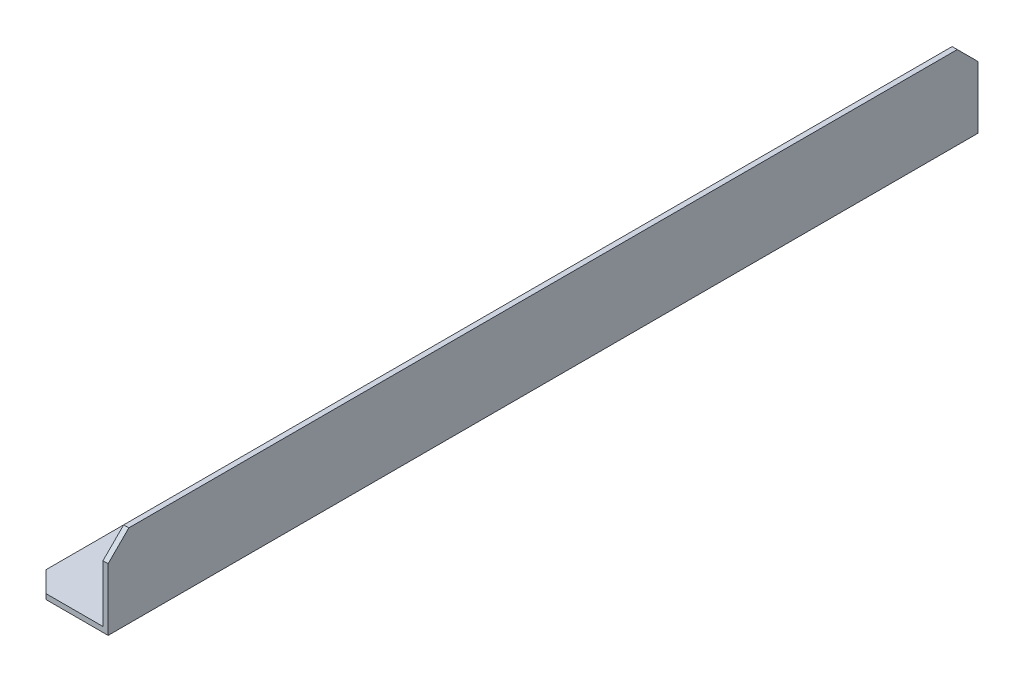
ISO-10303-21;
HEADER;
FILE_DESCRIPTION(('STEP AP214'),'2;1');
FILE_NAME('part.step','',(''),(''),'','','');
FILE_SCHEMA(('AUTOMOTIVE_DESIGN { 1 0 10303 214 1 1 1 1 }'));
ENDSEC;
DATA;
#1=APPLICATION_CONTEXT('core data for automotive mechanical design processes');
#2=APPLICATION_PROTOCOL_DEFINITION('international standard','automotive_design',2000,#1);
#3=PRODUCT_CONTEXT('',#1,'mechanical');
#4=PRODUCT('Part','Part','',(#3));
#5=PRODUCT_RELATED_PRODUCT_CATEGORY('part','',(#4));
#6=PRODUCT_DEFINITION_FORMATION('','',#4);
#7=PRODUCT_DEFINITION_CONTEXT('part definition',#1,'design');
#8=PRODUCT_DEFINITION('design','',#6,#7);
#9=PRODUCT_DEFINITION_SHAPE('','',#8);
#10=(LENGTH_UNIT() NAMED_UNIT(*) SI_UNIT(.MILLI.,.METRE.));
#11=(NAMED_UNIT(*) PLANE_ANGLE_UNIT() SI_UNIT($,.RADIAN.));
#12=(NAMED_UNIT(*) SI_UNIT($,.STERADIAN.) SOLID_ANGLE_UNIT());
#13=UNCERTAINTY_MEASURE_WITH_UNIT(LENGTH_MEASURE(1.E-05),#10,'distance_accuracy_value','');
#14=(GEOMETRIC_REPRESENTATION_CONTEXT(3) GLOBAL_UNCERTAINTY_ASSIGNED_CONTEXT((#13)) GLOBAL_UNIT_ASSIGNED_CONTEXT((#10,
#11,#12)) REPRESENTATION_CONTEXT('',''));
#15=CARTESIAN_POINT('',(0.,0.,0.));
#16=DIRECTION('',(0.,0.,1.));
#17=DIRECTION('',(1.,0.,0.));
#18=AXIS2_PLACEMENT_3D('',#15,#16,#17);
#19=CARTESIAN_POINT('',(0.,0.,-533.4));
#20=DIRECTION('',(0.,-1.,0.));
#21=DIRECTION('',(0.,0.,-1.));
#22=AXIS2_PLACEMENT_3D('',#19,#20,#21);
#23=PLANE('',#22);
#24=CARTESIAN_POINT('',(-26.9875,0.,-38.1000000000001));
#25=DIRECTION('',(0.,1.,0.));
#26=DIRECTION('',(0.,0.,1.));
#27=AXIS2_PLACEMENT_3D('',#24,#25,#26);
#28=CIRCLE('',#27,2.45745);
#29=CARTESIAN_POINT('',(-26.9875,0.,-35.6425500000001));
#30=VERTEX_POINT('',#29);
#31=EDGE_CURVE('E446',#30,#30,#28,.T.);
#32=ORIENTED_EDGE('',*,*,#31,.T.);
#33=EDGE_LOOP('',(#32));
#34=FACE_BOUND('',#33,.T.);
#35=CARTESIAN_POINT('',(-26.9875,0.,-152.4));
#36=DIRECTION('',(0.,1.,0.));
#37=DIRECTION('',(0.,0.,1.));
#38=AXIS2_PLACEMENT_3D('',#35,#36,#37);
#39=CIRCLE('',#38,2.45745);
#40=CARTESIAN_POINT('',(-26.9875,0.,-149.94255));
#41=VERTEX_POINT('',#40);
#42=EDGE_CURVE('E456',#41,#41,#39,.T.);
#43=ORIENTED_EDGE('',*,*,#42,.T.);
#44=EDGE_LOOP('',(#43));
#45=FACE_BOUND('',#44,.T.);
#46=CARTESIAN_POINT('',(-26.9875,0.,-266.7));
#47=DIRECTION('',(0.,1.,0.));
#48=DIRECTION('',(0.,0.,1.));
#49=AXIS2_PLACEMENT_3D('',#46,#47,#48);
#50=CIRCLE('',#49,2.45745);
#51=CARTESIAN_POINT('',(-26.9875,0.,-264.24255));
#52=VERTEX_POINT('',#51);
#53=EDGE_CURVE('E465',#52,#52,#50,.T.);
#54=ORIENTED_EDGE('',*,*,#53,.T.);
#55=EDGE_LOOP('',(#54));
#56=FACE_BOUND('',#55,.T.);
#57=CARTESIAN_POINT('',(-26.9875,0.,-381.));
#58=DIRECTION('',(0.,1.,0.));
#59=DIRECTION('',(0.,0.,1.));
#60=AXIS2_PLACEMENT_3D('',#57,#58,#59);
#61=CIRCLE('',#60,2.45745);
#62=CARTESIAN_POINT('',(-26.9875,0.,-378.54255));
#63=VERTEX_POINT('',#62);
#64=EDGE_CURVE('E474',#63,#63,#61,.T.);
#65=ORIENTED_EDGE('',*,*,#64,.T.);
#66=EDGE_LOOP('',(#65));
#67=FACE_BOUND('',#66,.T.);
#68=CARTESIAN_POINT('',(-26.9875,0.,-495.3));
#69=DIRECTION('',(0.,1.,0.));
#70=DIRECTION('',(0.,0.,1.));
#71=AXIS2_PLACEMENT_3D('',#68,#69,#70);
#72=CIRCLE('',#71,2.45745);
#73=CARTESIAN_POINT('',(-26.9875,0.,-492.84255));
#74=VERTEX_POINT('',#73);
#75=EDGE_CURVE('E155',#74,#74,#72,.T.);
#76=ORIENTED_EDGE('',*,*,#75,.T.);
#77=EDGE_LOOP('',(#76));
#78=FACE_BOUND('',#77,.T.);
#79=DIRECTION('',(0.,0.,1.));
#80=VECTOR('',#79,1.);
#81=CARTESIAN_POINT('',(-50.8,0.,-533.4));
#82=LINE('',#81,#80);
#83=CARTESIAN_POINT('',(-50.8,0.,-520.7));
#84=VERTEX_POINT('',#83);
#85=CARTESIAN_POINT('',(-50.8,0.,-12.7));
#86=VERTEX_POINT('',#85);
#87=EDGE_CURVE('E161',#84,#86,#82,.T.);
#88=ORIENTED_EDGE('',*,*,#87,.F.);
#89=DIRECTION('',(-0.707106781186546,0.,0.707106781186549));
#90=VECTOR('',#89,1.);
#91=CARTESIAN_POINT('',(-19.05,0.,-552.45));
#92=LINE('',#91,#90);
#93=CARTESIAN_POINT('',(-38.0999999999999,0.,-533.4));
#94=VERTEX_POINT('',#93);
#95=EDGE_CURVE('E128',#84,#94,#92,.F.);
#96=ORIENTED_EDGE('',*,*,#95,.T.);
#97=DIRECTION('',(1.,0.,0.));
#98=VECTOR('',#97,1.);
#99=CARTESIAN_POINT('',(0.,0.,-533.4));
#100=LINE('',#99,#98);
#101=CARTESIAN_POINT('',(0.,0.,-533.4));
#102=VERTEX_POINT('',#101);
#103=EDGE_CURVE('E123',#94,#102,#100,.T.);
#104=ORIENTED_EDGE('',*,*,#103,.T.);
#105=DIRECTION('',(0.,0.,1.));
#106=VECTOR('',#105,1.);
#107=CARTESIAN_POINT('',(0.,0.,-533.4));
#108=LINE('',#107,#106);
#109=CARTESIAN_POINT('',(0.,0.,0.));
#110=VERTEX_POINT('',#109);
#111=EDGE_CURVE('E127',#102,#110,#108,.T.);
#112=ORIENTED_EDGE('',*,*,#111,.T.);
#113=DIRECTION('',(1.,0.,0.));
#114=VECTOR('',#113,1.);
#115=CARTESIAN_POINT('',(0.,0.,0.));
#116=LINE('',#115,#114);
#117=CARTESIAN_POINT('',(-38.1,0.,0.));
#118=VERTEX_POINT('',#117);
#119=EDGE_CURVE('E153',#118,#110,#116,.T.);
#120=ORIENTED_EDGE('',*,*,#119,.F.);
#121=DIRECTION('',(-0.707106781186548,0.,-0.707106781186548));
#122=VECTOR('',#121,1.);
#123=CARTESIAN_POINT('',(-285.75,0.,-247.65));
#124=LINE('',#123,#122);
#125=EDGE_CURVE('E179',#118,#86,#124,.T.);
#126=ORIENTED_EDGE('',*,*,#125,.T.);
#127=EDGE_LOOP('',(#88,#96,#104,#112,#120,#126));
#128=FACE_BOUND('',#127,.T.);
#129=ADVANCED_FACE('F43',(#34,#45,#56,#67,#78,#128),#23,.T.);
#130=CARTESIAN_POINT('',(-50.8,0.,-533.4));
#131=DIRECTION('',(-1.,0.,0.));
#132=DIRECTION('',(0.,0.,1.));
#133=AXIS2_PLACEMENT_3D('',#130,#131,#132);
#134=PLANE('',#133);
#135=DIRECTION('',(0.,0.,1.));
#136=VECTOR('',#135,1.);
#137=CARTESIAN_POINT('',(-50.8,3.175,-533.4));
#138=LINE('',#137,#136);
#139=CARTESIAN_POINT('',(-50.8,3.175,-520.7));
#140=VERTEX_POINT('',#139);
#141=CARTESIAN_POINT('',(-50.8,3.175,-12.7));
#142=VERTEX_POINT('',#141);
#143=EDGE_CURVE('E165',#140,#142,#138,.T.);
#144=ORIENTED_EDGE('',*,*,#143,.F.);
#145=DIRECTION('',(0.,-1.,0.));
#146=VECTOR('',#145,1.);
#147=CARTESIAN_POINT('',(-50.8,0.,-520.7));
#148=LINE('',#147,#146);
#149=EDGE_CURVE('E176',#140,#84,#148,.T.);
#150=ORIENTED_EDGE('',*,*,#149,.T.);
#151=ORIENTED_EDGE('',*,*,#87,.T.);
#152=DIRECTION('',(0.,1.,0.));
#153=VECTOR('',#152,1.);
#154=CARTESIAN_POINT('',(-50.8,3.175,-12.7));
#155=LINE('',#154,#153);
#156=EDGE_CURVE('E164',#86,#142,#155,.T.);
#157=ORIENTED_EDGE('',*,*,#156,.T.);
#158=EDGE_LOOP('',(#144,#150,#151,#157));
#159=FACE_BOUND('',#158,.T.);
#160=ADVANCED_FACE('F209',(#159),#134,.T.);
#161=CARTESIAN_POINT('',(-3.175,3.175,-533.4));
#162=DIRECTION('',(0.,1.,0.));
#163=DIRECTION('',(0.,0.,1.));
#164=AXIS2_PLACEMENT_3D('',#161,#162,#163);
#165=PLANE('',#164);
#166=CARTESIAN_POINT('',(-26.9875,3.175,-38.1000000000001));
#167=DIRECTION('',(0.,1.,0.));
#168=DIRECTION('',(0.,0.,1.));
#169=AXIS2_PLACEMENT_3D('',#166,#167,#168);
#170=CIRCLE('',#169,4.2164);
#171=CARTESIAN_POINT('',(-26.9875,3.175,-33.8836000000001));
#172=VERTEX_POINT('',#171);
#173=EDGE_CURVE('E444',#172,#172,#170,.T.);
#174=ORIENTED_EDGE('',*,*,#173,.F.);
#175=EDGE_LOOP('',(#174));
#176=FACE_BOUND('',#175,.T.);
#177=CARTESIAN_POINT('',(-26.9875,3.175,-152.4));
#178=DIRECTION('',(0.,1.,0.));
#179=DIRECTION('',(0.,0.,1.));
#180=AXIS2_PLACEMENT_3D('',#177,#178,#179);
#181=CIRCLE('',#180,4.2164);
#182=CARTESIAN_POINT('',(-26.9875,3.175,-148.1836));
#183=VERTEX_POINT('',#182);
#184=EDGE_CURVE('E450',#183,#183,#181,.T.);
#185=ORIENTED_EDGE('',*,*,#184,.F.);
#186=EDGE_LOOP('',(#185));
#187=FACE_BOUND('',#186,.T.);
#188=CARTESIAN_POINT('',(-26.9875,3.175,-266.7));
#189=DIRECTION('',(0.,1.,0.));
#190=DIRECTION('',(0.,0.,1.));
#191=AXIS2_PLACEMENT_3D('',#188,#189,#190);
#192=CIRCLE('',#191,4.2164);
#193=CARTESIAN_POINT('',(-26.9875,3.175,-262.4836));
#194=VERTEX_POINT('',#193);
#195=EDGE_CURVE('E459',#194,#194,#192,.T.);
#196=ORIENTED_EDGE('',*,*,#195,.F.);
#197=EDGE_LOOP('',(#196));
#198=FACE_BOUND('',#197,.T.);
#199=CARTESIAN_POINT('',(-26.9875,3.175,-381.));
#200=DIRECTION('',(0.,1.,0.));
#201=DIRECTION('',(0.,0.,1.));
#202=AXIS2_PLACEMENT_3D('',#199,#200,#201);
#203=CIRCLE('',#202,4.2164);
#204=CARTESIAN_POINT('',(-26.9875,3.175,-376.7836));
#205=VERTEX_POINT('',#204);
#206=EDGE_CURVE('E468',#205,#205,#203,.T.);
#207=ORIENTED_EDGE('',*,*,#206,.F.);
#208=EDGE_LOOP('',(#207));
#209=FACE_BOUND('',#208,.T.);
#210=CARTESIAN_POINT('',(-26.9875,3.175,-495.3));
#211=DIRECTION('',(0.,1.,0.));
#212=DIRECTION('',(0.,0.,1.));
#213=AXIS2_PLACEMENT_3D('',#210,#211,#212);
#214=CIRCLE('',#213,4.2164);
#215=CARTESIAN_POINT('',(-26.9875,3.175,-491.0836));
#216=VERTEX_POINT('',#215);
#217=EDGE_CURVE('E477',#216,#216,#214,.T.);
#218=ORIENTED_EDGE('',*,*,#217,.F.);
#219=EDGE_LOOP('',(#218));
#220=FACE_BOUND('',#219,.T.);
#221=DIRECTION('',(-1.,0.,0.));
#222=VECTOR('',#221,1.);
#223=CARTESIAN_POINT('',(-3.175,3.175,-533.4));
#224=LINE('',#223,#222);
#225=CARTESIAN_POINT('',(-3.175,3.175,-533.4));
#226=VERTEX_POINT('',#225);
#227=CARTESIAN_POINT('',(-38.0999999999999,3.175,-533.4));
#228=VERTEX_POINT('',#227);
#229=EDGE_CURVE('E140',#226,#228,#224,.T.);
#230=ORIENTED_EDGE('',*,*,#229,.T.);
#231=DIRECTION('',(0.707106781186546,0.,-0.707106781186549));
#232=VECTOR('',#231,1.);
#233=CARTESIAN_POINT('',(-20.6375,3.175,-550.8625));
#234=LINE('',#233,#232);
#235=EDGE_CURVE('E187',#228,#140,#234,.F.);
#236=ORIENTED_EDGE('',*,*,#235,.T.);
#237=ORIENTED_EDGE('',*,*,#143,.T.);
#238=DIRECTION('',(0.707106781186548,0.,0.707106781186548));
#239=VECTOR('',#238,1.);
#240=CARTESIAN_POINT('',(-287.3375,3.175,-249.2375));
#241=LINE('',#240,#239);
#242=CARTESIAN_POINT('',(-38.1,3.175,0.));
#243=VERTEX_POINT('',#242);
#244=EDGE_CURVE('E185',#142,#243,#241,.T.);
#245=ORIENTED_EDGE('',*,*,#244,.T.);
#246=DIRECTION('',(-1.,0.,0.));
#247=VECTOR('',#246,1.);
#248=CARTESIAN_POINT('',(-3.175,3.175,0.));
#249=LINE('',#248,#247);
#250=CARTESIAN_POINT('',(-3.175,3.175,0.));
#251=VERTEX_POINT('',#250);
#252=EDGE_CURVE('E133',#251,#243,#249,.T.);
#253=ORIENTED_EDGE('',*,*,#252,.F.);
#254=DIRECTION('',(0.,0.,1.));
#255=VECTOR('',#254,1.);
#256=CARTESIAN_POINT('',(-3.175,3.175,-533.4));
#257=LINE('',#256,#255);
#258=EDGE_CURVE('E168',#226,#251,#257,.T.);
#259=ORIENTED_EDGE('',*,*,#258,.F.);
#260=EDGE_LOOP('',(#230,#236,#237,#245,#253,#259));
#261=FACE_BOUND('',#260,.T.);
#262=ADVANCED_FACE('F212',(#176,#187,#198,#209,#220,#261),#165,.T.);
#263=CARTESIAN_POINT('',(-3.175,3.175,-533.4));
#264=DIRECTION('',(-1.,0.,0.));
#265=DIRECTION('',(0.,0.,1.));
#266=AXIS2_PLACEMENT_3D('',#263,#264,#265);
#267=PLANE('',#266);
#268=DIRECTION('',(0.,0.,1.));
#269=VECTOR('',#268,1.);
#270=CARTESIAN_POINT('',(-3.175,50.8,-533.4));
#271=LINE('',#270,#269);
#272=CARTESIAN_POINT('',(-3.175,50.8,-520.7));
#273=VERTEX_POINT('',#272);
#274=CARTESIAN_POINT('',(-3.175,50.8,-12.7));
#275=VERTEX_POINT('',#274);
#276=EDGE_CURVE('E171',#273,#275,#271,.T.);
#277=ORIENTED_EDGE('',*,*,#276,.F.);
#278=DIRECTION('',(0.,0.707106781186546,0.707106781186549));
#279=VECTOR('',#278,1.);
#280=CARTESIAN_POINT('',(-3.175,20.6375,-550.8625));
#281=LINE('',#280,#279);
#282=CARTESIAN_POINT('',(-3.175,38.0999999999999,-533.4));
#283=VERTEX_POINT('',#282);
#284=EDGE_CURVE('E195',#273,#283,#281,.F.);
#285=ORIENTED_EDGE('',*,*,#284,.T.);
#286=DIRECTION('',(0.,-1.,0.));
#287=VECTOR('',#286,1.);
#288=CARTESIAN_POINT('',(-3.175,3.175,-533.4));
#289=LINE('',#288,#287);
#290=EDGE_CURVE('E146',#283,#226,#289,.T.);
#291=ORIENTED_EDGE('',*,*,#290,.T.);
#292=ORIENTED_EDGE('',*,*,#258,.T.);
#293=DIRECTION('',(0.,-1.,0.));
#294=VECTOR('',#293,1.);
#295=CARTESIAN_POINT('',(-3.175,3.175,0.));
#296=LINE('',#295,#294);
#297=CARTESIAN_POINT('',(-3.175,38.1,0.));
#298=VERTEX_POINT('',#297);
#299=EDGE_CURVE('E157',#298,#251,#296,.T.);
#300=ORIENTED_EDGE('',*,*,#299,.F.);
#301=DIRECTION('',(0.,0.707106781186548,-0.707106781186548));
#302=VECTOR('',#301,1.);
#303=CARTESIAN_POINT('',(-3.175,287.3375,-249.2375));
#304=LINE('',#303,#302);
#305=EDGE_CURVE('E67',#298,#275,#304,.T.);
#306=ORIENTED_EDGE('',*,*,#305,.T.);
#307=EDGE_LOOP('',(#277,#285,#291,#292,#300,#306));
#308=FACE_BOUND('',#307,.T.);
#309=ADVANCED_FACE('F221',(#308),#267,.T.);
#310=CARTESIAN_POINT('',(0.,50.8,-533.4));
#311=DIRECTION('',(0.,1.,0.));
#312=DIRECTION('',(0.,0.,1.));
#313=AXIS2_PLACEMENT_3D('',#310,#311,#312);
#314=PLANE('',#313);
#315=DIRECTION('',(0.,0.,1.));
#316=VECTOR('',#315,1.);
#317=CARTESIAN_POINT('',(0.,50.8,-533.4));
#318=LINE('',#317,#316);
#319=CARTESIAN_POINT('',(0.,50.8,-520.7));
#320=VERTEX_POINT('',#319);
#321=CARTESIAN_POINT('',(0.,50.8,-12.7));
#322=VERTEX_POINT('',#321);
#323=EDGE_CURVE('E139',#320,#322,#318,.T.);
#324=ORIENTED_EDGE('',*,*,#323,.F.);
#325=DIRECTION('',(-1.,0.,0.));
#326=VECTOR('',#325,1.);
#327=CARTESIAN_POINT('',(0.,50.8,-520.7));
#328=LINE('',#327,#326);
#329=EDGE_CURVE('E191',#320,#273,#328,.T.);
#330=ORIENTED_EDGE('',*,*,#329,.T.);
#331=ORIENTED_EDGE('',*,*,#276,.T.);
#332=DIRECTION('',(1.,0.,0.));
#333=VECTOR('',#332,1.);
#334=CARTESIAN_POINT('',(0.,50.8,-12.7));
#335=LINE('',#334,#333);
#336=EDGE_CURVE('E189',#275,#322,#335,.T.);
#337=ORIENTED_EDGE('',*,*,#336,.T.);
#338=EDGE_LOOP('',(#324,#330,#331,#337));
#339=FACE_BOUND('',#338,.T.);
#340=ADVANCED_FACE('F227',(#339),#314,.T.);
#341=CARTESIAN_POINT('',(0.,0.,-533.4));
#342=DIRECTION('',(1.,0.,0.));
#343=DIRECTION('',(0.,1.,0.));
#344=AXIS2_PLACEMENT_3D('',#341,#342,#343);
#345=PLANE('',#344);
#346=DIRECTION('',(0.,1.,0.));
#347=VECTOR('',#346,1.);
#348=CARTESIAN_POINT('',(0.,0.,-533.4));
#349=LINE('',#348,#347);
#350=CARTESIAN_POINT('',(0.,38.0999999999999,-533.4));
#351=VERTEX_POINT('',#350);
#352=EDGE_CURVE('E132',#102,#351,#349,.T.);
#353=ORIENTED_EDGE('',*,*,#352,.T.);
#354=DIRECTION('',(0.,-0.707106781186546,-0.707106781186549));
#355=VECTOR('',#354,1.);
#356=CARTESIAN_POINT('',(0.,19.05,-552.45));
#357=LINE('',#356,#355);
#358=EDGE_CURVE('E198',#351,#320,#357,.F.);
#359=ORIENTED_EDGE('',*,*,#358,.T.);
#360=ORIENTED_EDGE('',*,*,#323,.T.);
#361=DIRECTION('',(0.,-0.707106781186548,0.707106781186548));
#362=VECTOR('',#361,1.);
#363=CARTESIAN_POINT('',(0.,285.75,-247.65));
#364=LINE('',#363,#362);
#365=CARTESIAN_POINT('',(0.,38.1,0.));
#366=VERTEX_POINT('',#365);
#367=EDGE_CURVE('E59',#322,#366,#364,.T.);
#368=ORIENTED_EDGE('',*,*,#367,.T.);
#369=DIRECTION('',(0.,1.,0.));
#370=VECTOR('',#369,1.);
#371=CARTESIAN_POINT('',(0.,0.,0.));
#372=LINE('',#371,#370);
#373=EDGE_CURVE('E138',#110,#366,#372,.T.);
#374=ORIENTED_EDGE('',*,*,#373,.F.);
#375=ORIENTED_EDGE('',*,*,#111,.F.);
#376=EDGE_LOOP('',(#353,#359,#360,#368,#374,#375));
#377=FACE_BOUND('',#376,.T.);
#378=ADVANCED_FACE('F136',(#377),#345,.T.);
#379=CARTESIAN_POINT('',(0.,0.,-533.4));
#380=DIRECTION('',(0.,0.,-1.));
#381=DIRECTION('',(-1.,0.,0.));
#382=AXIS2_PLACEMENT_3D('',#379,#380,#381);
#383=PLANE('',#382);
#384=ORIENTED_EDGE('',*,*,#103,.F.);
#385=DIRECTION('',(0.,1.,0.));
#386=VECTOR('',#385,1.);
#387=CARTESIAN_POINT('',(-38.0999999999999,0.,-533.4));
#388=LINE('',#387,#386);
#389=EDGE_CURVE('E183',#94,#228,#388,.T.);
#390=ORIENTED_EDGE('',*,*,#389,.T.);
#391=ORIENTED_EDGE('',*,*,#229,.F.);
#392=ORIENTED_EDGE('',*,*,#290,.F.);
#393=DIRECTION('',(1.,0.,0.));
#394=VECTOR('',#393,1.);
#395=CARTESIAN_POINT('',(0.,38.0999999999999,-533.4));
#396=LINE('',#395,#394);
#397=EDGE_CURVE('E145',#283,#351,#396,.T.);
#398=ORIENTED_EDGE('',*,*,#397,.T.);
#399=ORIENTED_EDGE('',*,*,#352,.F.);
#400=EDGE_LOOP('',(#384,#390,#391,#392,#398,#399));
#401=FACE_BOUND('',#400,.T.);
#402=ADVANCED_FACE('F142',(#401),#383,.T.);
#403=CARTESIAN_POINT('',(0.,0.,0.));
#404=DIRECTION('',(0.,0.,-1.));
#405=DIRECTION('',(-1.,0.,0.));
#406=AXIS2_PLACEMENT_3D('',#403,#404,#405);
#407=PLANE('',#406);
#408=ORIENTED_EDGE('',*,*,#373,.T.);
#409=DIRECTION('',(-1.,0.,0.));
#410=VECTOR('',#409,1.);
#411=CARTESIAN_POINT('',(-3.175,38.1,0.));
#412=LINE('',#411,#410);
#413=EDGE_CURVE('E11',#366,#298,#412,.T.);
#414=ORIENTED_EDGE('',*,*,#413,.T.);
#415=ORIENTED_EDGE('',*,*,#299,.T.);
#416=ORIENTED_EDGE('',*,*,#252,.T.);
#417=DIRECTION('',(0.,-1.,0.));
#418=VECTOR('',#417,1.);
#419=CARTESIAN_POINT('',(-38.1,0.,0.));
#420=LINE('',#419,#418);
#421=EDGE_CURVE('E52',#243,#118,#420,.T.);
#422=ORIENTED_EDGE('',*,*,#421,.T.);
#423=ORIENTED_EDGE('',*,*,#119,.T.);
#424=EDGE_LOOP('',(#408,#414,#415,#416,#422,#423));
#425=FACE_BOUND('',#424,.T.);
#426=ADVANCED_FACE('F202',(#425),#407,.F.);
#427=CARTESIAN_POINT('',(-50.8,0.,-520.7));
#428=DIRECTION('',(0.707106781186549,0.,0.707106781186546));
#429=DIRECTION('',(0.,-1.,0.));
#430=AXIS2_PLACEMENT_3D('',#427,#428,#429);
#431=PLANE('',#430);
#432=ORIENTED_EDGE('',*,*,#235,.F.);
#433=ORIENTED_EDGE('',*,*,#389,.F.);
#434=ORIENTED_EDGE('',*,*,#95,.F.);
#435=ORIENTED_EDGE('',*,*,#149,.F.);
#436=EDGE_LOOP('',(#432,#433,#434,#435));
#437=FACE_BOUND('',#436,.T.);
#438=ADVANCED_FACE('F216',(#437),#431,.F.);
#439=CARTESIAN_POINT('',(0.,50.8,-520.7));
#440=DIRECTION('',(0.,-0.707106781186549,0.707106781186546));
#441=DIRECTION('',(-1.,0.,0.));
#442=AXIS2_PLACEMENT_3D('',#439,#440,#441);
#443=PLANE('',#442);
#444=ORIENTED_EDGE('',*,*,#358,.F.);
#445=ORIENTED_EDGE('',*,*,#397,.F.);
#446=ORIENTED_EDGE('',*,*,#284,.F.);
#447=ORIENTED_EDGE('',*,*,#329,.F.);
#448=EDGE_LOOP('',(#444,#445,#446,#447));
#449=FACE_BOUND('',#448,.T.);
#450=ADVANCED_FACE('F223',(#449),#443,.F.);
#451=CARTESIAN_POINT('',(0.,38.1,0.));
#452=DIRECTION('',(0.,0.707106781186548,0.707106781186548));
#453=DIRECTION('',(1.,0.,0.));
#454=AXIS2_PLACEMENT_3D('',#451,#452,#453);
#455=PLANE('',#454);
#456=ORIENTED_EDGE('',*,*,#367,.F.);
#457=ORIENTED_EDGE('',*,*,#336,.F.);
#458=ORIENTED_EDGE('',*,*,#305,.F.);
#459=ORIENTED_EDGE('',*,*,#413,.F.);
#460=EDGE_LOOP('',(#456,#457,#458,#459));
#461=FACE_BOUND('',#460,.T.);
#462=ADVANCED_FACE('F228',(#461),#455,.T.);
#463=CARTESIAN_POINT('',(-38.1,0.,0.));
#464=DIRECTION('',(-0.707106781186548,0.,0.707106781186548));
#465=DIRECTION('',(0.,1.,0.));
#466=AXIS2_PLACEMENT_3D('',#463,#464,#465);
#467=PLANE('',#466);
#468=ORIENTED_EDGE('',*,*,#244,.F.);
#469=ORIENTED_EDGE('',*,*,#156,.F.);
#470=ORIENTED_EDGE('',*,*,#125,.F.);
#471=ORIENTED_EDGE('',*,*,#421,.F.);
#472=EDGE_LOOP('',(#468,#469,#470,#471));
#473=FACE_BOUND('',#472,.T.);
#474=ADVANCED_FACE('F46',(#473),#467,.T.);
#475=CARTESIAN_POINT('',(-26.9875,3.175,-495.3));
#476=DIRECTION('',(0.,1.,0.));
#477=DIRECTION('',(0.,0.,1.));
#478=AXIS2_PLACEMENT_3D('',#475,#476,#477);
#479=CYLINDRICAL_SURFACE('',#478,2.45745);
#480=ORIENTED_EDGE('',*,*,#75,.F.);
#481=EDGE_LOOP('',(#480));
#482=FACE_BOUND('',#481,.T.);
#483=CARTESIAN_POINT('',(-26.9875,1.69906570374072,-495.3));
#484=DIRECTION('',(0.,1.,0.));
#485=DIRECTION('',(0.,0.,1.));
#486=AXIS2_PLACEMENT_3D('',#483,#484,#485);
#487=CIRCLE('',#486,2.45745);
#488=CARTESIAN_POINT('',(-26.9875,1.69906570374072,-492.84255));
#489=VERTEX_POINT('',#488);
#490=EDGE_CURVE('E480',#489,#489,#487,.T.);
#491=ORIENTED_EDGE('',*,*,#490,.T.);
#492=EDGE_LOOP('',(#491));
#493=FACE_BOUND('',#492,.T.);
#494=ADVANCED_FACE('F234',(#482,#493),#479,.F.);
#495=CARTESIAN_POINT('',(-26.9875,3.175,-495.3));
#496=DIRECTION('',(0.,1.,0.));
#497=DIRECTION('',(0.,0.,1.));
#498=AXIS2_PLACEMENT_3D('',#495,#496,#497);
#499=CONICAL_SURFACE('',#498,4.2164,0.872664625997164);
#500=ORIENTED_EDGE('',*,*,#490,.F.);
#501=EDGE_LOOP('',(#500));
#502=FACE_BOUND('',#501,.T.);
#503=ORIENTED_EDGE('',*,*,#217,.T.);
#504=EDGE_LOOP('',(#503));
#505=FACE_BOUND('',#504,.T.);
#506=ADVANCED_FACE('F345',(#502,#505),#499,.F.);
#507=CARTESIAN_POINT('',(-26.9875,3.175,-381.));
#508=DIRECTION('',(0.,1.,0.));
#509=DIRECTION('',(0.,0.,1.));
#510=AXIS2_PLACEMENT_3D('',#507,#508,#509);
#511=CYLINDRICAL_SURFACE('',#510,2.45745);
#512=ORIENTED_EDGE('',*,*,#64,.F.);
#513=EDGE_LOOP('',(#512));
#514=FACE_BOUND('',#513,.T.);
#515=CARTESIAN_POINT('',(-26.9875,1.69906570374072,-381.));
#516=DIRECTION('',(0.,1.,0.));
#517=DIRECTION('',(0.,0.,1.));
#518=AXIS2_PLACEMENT_3D('',#515,#516,#517);
#519=CIRCLE('',#518,2.45745);
#520=CARTESIAN_POINT('',(-26.9875,1.69906570374072,-378.54255));
#521=VERTEX_POINT('',#520);
#522=EDGE_CURVE('E471',#521,#521,#519,.T.);
#523=ORIENTED_EDGE('',*,*,#522,.T.);
#524=EDGE_LOOP('',(#523));
#525=FACE_BOUND('',#524,.T.);
#526=ADVANCED_FACE('F354',(#514,#525),#511,.F.);
#527=CARTESIAN_POINT('',(-26.9875,3.175,-381.));
#528=DIRECTION('',(0.,1.,0.));
#529=DIRECTION('',(0.,0.,1.));
#530=AXIS2_PLACEMENT_3D('',#527,#528,#529);
#531=CONICAL_SURFACE('',#530,4.2164,0.872664625997164);
#532=ORIENTED_EDGE('',*,*,#522,.F.);
#533=EDGE_LOOP('',(#532));
#534=FACE_BOUND('',#533,.T.);
#535=ORIENTED_EDGE('',*,*,#206,.T.);
#536=EDGE_LOOP('',(#535));
#537=FACE_BOUND('',#536,.T.);
#538=ADVANCED_FACE('F363',(#534,#537),#531,.F.);
#539=CARTESIAN_POINT('',(-26.9875,3.175,-266.7));
#540=DIRECTION('',(0.,1.,0.));
#541=DIRECTION('',(0.,0.,1.));
#542=AXIS2_PLACEMENT_3D('',#539,#540,#541);
#543=CYLINDRICAL_SURFACE('',#542,2.45745);
#544=ORIENTED_EDGE('',*,*,#53,.F.);
#545=EDGE_LOOP('',(#544));
#546=FACE_BOUND('',#545,.T.);
#547=CARTESIAN_POINT('',(-26.9875,1.69906570374072,-266.7));
#548=DIRECTION('',(0.,1.,0.));
#549=DIRECTION('',(0.,0.,1.));
#550=AXIS2_PLACEMENT_3D('',#547,#548,#549);
#551=CIRCLE('',#550,2.45745);
#552=CARTESIAN_POINT('',(-26.9875,1.69906570374072,-264.24255));
#553=VERTEX_POINT('',#552);
#554=EDGE_CURVE('E462',#553,#553,#551,.T.);
#555=ORIENTED_EDGE('',*,*,#554,.T.);
#556=EDGE_LOOP('',(#555));
#557=FACE_BOUND('',#556,.T.);
#558=ADVANCED_FACE('F372',(#546,#557),#543,.F.);
#559=CARTESIAN_POINT('',(-26.9875,3.175,-266.7));
#560=DIRECTION('',(0.,1.,0.));
#561=DIRECTION('',(0.,0.,1.));
#562=AXIS2_PLACEMENT_3D('',#559,#560,#561);
#563=CONICAL_SURFACE('',#562,4.2164,0.872664625997164);
#564=ORIENTED_EDGE('',*,*,#554,.F.);
#565=EDGE_LOOP('',(#564));
#566=FACE_BOUND('',#565,.T.);
#567=ORIENTED_EDGE('',*,*,#195,.T.);
#568=EDGE_LOOP('',(#567));
#569=FACE_BOUND('',#568,.T.);
#570=ADVANCED_FACE('F381',(#566,#569),#563,.F.);
#571=CARTESIAN_POINT('',(-26.9875,3.175,-152.4));
#572=DIRECTION('',(0.,1.,0.));
#573=DIRECTION('',(0.,0.,1.));
#574=AXIS2_PLACEMENT_3D('',#571,#572,#573);
#575=CYLINDRICAL_SURFACE('',#574,2.45745);
#576=ORIENTED_EDGE('',*,*,#42,.F.);
#577=EDGE_LOOP('',(#576));
#578=FACE_BOUND('',#577,.T.);
#579=CARTESIAN_POINT('',(-26.9875,1.69906570374072,-152.4));
#580=DIRECTION('',(0.,1.,0.));
#581=DIRECTION('',(0.,0.,1.));
#582=AXIS2_PLACEMENT_3D('',#579,#580,#581);
#583=CIRCLE('',#582,2.45745);
#584=CARTESIAN_POINT('',(-26.9875,1.69906570374072,-149.94255));
#585=VERTEX_POINT('',#584);
#586=EDGE_CURVE('E453',#585,#585,#583,.T.);
#587=ORIENTED_EDGE('',*,*,#586,.T.);
#588=EDGE_LOOP('',(#587));
#589=FACE_BOUND('',#588,.T.);
#590=ADVANCED_FACE('F390',(#578,#589),#575,.F.);
#591=CARTESIAN_POINT('',(-26.9875,3.175,-152.4));
#592=DIRECTION('',(0.,1.,0.));
#593=DIRECTION('',(0.,0.,1.));
#594=AXIS2_PLACEMENT_3D('',#591,#592,#593);
#595=CONICAL_SURFACE('',#594,4.2164,0.872664625997164);
#596=ORIENTED_EDGE('',*,*,#586,.F.);
#597=EDGE_LOOP('',(#596));
#598=FACE_BOUND('',#597,.T.);
#599=ORIENTED_EDGE('',*,*,#184,.T.);
#600=EDGE_LOOP('',(#599));
#601=FACE_BOUND('',#600,.T.);
#602=ADVANCED_FACE('F399',(#598,#601),#595,.F.);
#603=CARTESIAN_POINT('',(-26.9875,3.175,-38.1000000000001));
#604=DIRECTION('',(0.,1.,0.));
#605=DIRECTION('',(0.,0.,1.));
#606=AXIS2_PLACEMENT_3D('',#603,#604,#605);
#607=CYLINDRICAL_SURFACE('',#606,2.45745);
#608=ORIENTED_EDGE('',*,*,#31,.F.);
#609=EDGE_LOOP('',(#608));
#610=FACE_BOUND('',#609,.T.);
#611=CARTESIAN_POINT('',(-26.9875,1.69906570374072,-38.1000000000001));
#612=DIRECTION('',(0.,1.,0.));
#613=DIRECTION('',(0.,0.,1.));
#614=AXIS2_PLACEMENT_3D('',#611,#612,#613);
#615=CIRCLE('',#614,2.45745);
#616=CARTESIAN_POINT('',(-26.9875,1.69906570374072,-35.6425500000001));
#617=VERTEX_POINT('',#616);
#618=EDGE_CURVE('E441',#617,#617,#615,.T.);
#619=ORIENTED_EDGE('',*,*,#618,.T.);
#620=EDGE_LOOP('',(#619));
#621=FACE_BOUND('',#620,.T.);
#622=ADVANCED_FACE('F408',(#610,#621),#607,.F.);
#623=CARTESIAN_POINT('',(-26.9875,3.175,-38.1000000000001));
#624=DIRECTION('',(0.,1.,0.));
#625=DIRECTION('',(0.,0.,1.));
#626=AXIS2_PLACEMENT_3D('',#623,#624,#625);
#627=CONICAL_SURFACE('',#626,4.2164,0.872664625997164);
#628=ORIENTED_EDGE('',*,*,#618,.F.);
#629=EDGE_LOOP('',(#628));
#630=FACE_BOUND('',#629,.T.);
#631=ORIENTED_EDGE('',*,*,#173,.T.);
#632=EDGE_LOOP('',(#631));
#633=FACE_BOUND('',#632,.T.);
#634=ADVANCED_FACE('F417',(#630,#633),#627,.F.);
#635=CLOSED_SHELL('',(#129,#160,#262,#309,#340,#378,#402,#426,#438,#450,#462,#474,#494,#506,
#526,#538,#558,#570,#590,#602,#622,#634));
#636=MANIFOLD_SOLID_BREP('B2',#635);
#637=ADVANCED_BREP_SHAPE_REPRESENTATION('',(#18,#636),#14);
#638=SHAPE_DEFINITION_REPRESENTATION(#9,#637);
ENDSEC;
END-ISO-10303-21;
